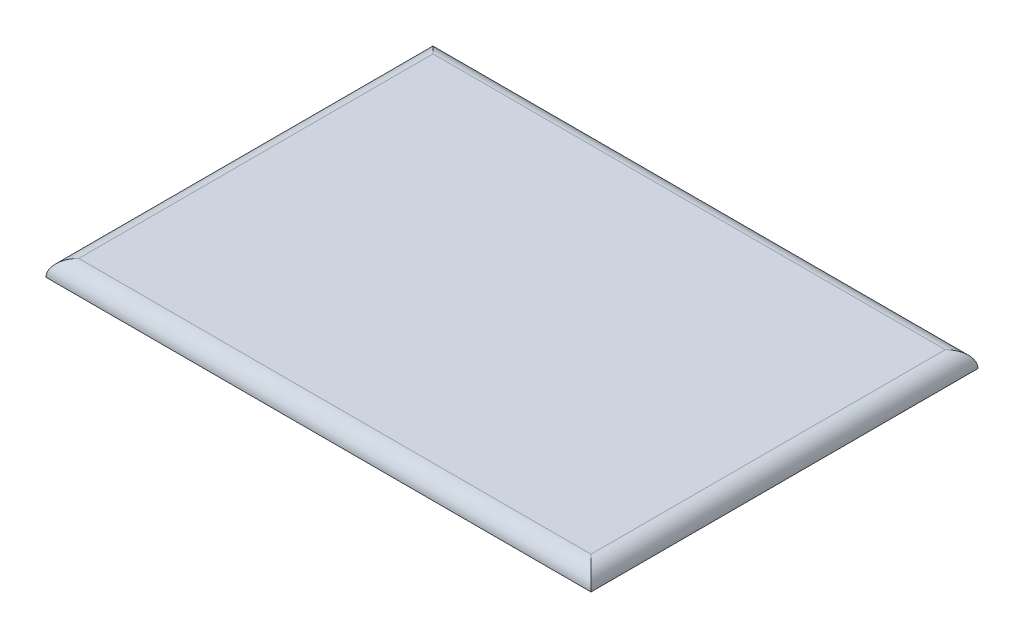
ISO-10303-21;
HEADER;
FILE_DESCRIPTION(('STEP AP214'),'2;1');
FILE_NAME('part.step','',(''),(''),'','','');
FILE_SCHEMA(('AUTOMOTIVE_DESIGN { 1 0 10303 214 1 1 1 1 }'));
ENDSEC;
DATA;
#1=APPLICATION_CONTEXT('core data for automotive mechanical design processes');
#2=APPLICATION_PROTOCOL_DEFINITION('international standard','automotive_design',2000,#1);
#3=PRODUCT_CONTEXT('',#1,'mechanical');
#4=PRODUCT('Part','Part','',(#3));
#5=PRODUCT_RELATED_PRODUCT_CATEGORY('part','',(#4));
#6=PRODUCT_DEFINITION_FORMATION('','',#4);
#7=PRODUCT_DEFINITION_CONTEXT('part definition',#1,'design');
#8=PRODUCT_DEFINITION('design','',#6,#7);
#9=PRODUCT_DEFINITION_SHAPE('','',#8);
#10=(LENGTH_UNIT() NAMED_UNIT(*) SI_UNIT(.MILLI.,.METRE.));
#11=(NAMED_UNIT(*) PLANE_ANGLE_UNIT() SI_UNIT($,.RADIAN.));
#12=(NAMED_UNIT(*) SI_UNIT($,.STERADIAN.) SOLID_ANGLE_UNIT());
#13=UNCERTAINTY_MEASURE_WITH_UNIT(LENGTH_MEASURE(1.E-05),#10,'distance_accuracy_value','');
#14=(GEOMETRIC_REPRESENTATION_CONTEXT(3) GLOBAL_UNCERTAINTY_ASSIGNED_CONTEXT((#13)) GLOBAL_UNIT_ASSIGNED_CONTEXT((#10,
#11,#12)) REPRESENTATION_CONTEXT('',''));
#15=CARTESIAN_POINT('',(0.,0.,0.));
#16=DIRECTION('',(0.,0.,1.));
#17=DIRECTION('',(1.,0.,0.));
#18=AXIS2_PLACEMENT_3D('',#15,#16,#17);
#19=CARTESIAN_POINT('',(0.,3.,0.));
#20=DIRECTION('',(0.,1.,0.));
#21=DIRECTION('',(0.,0.,1.));
#22=AXIS2_PLACEMENT_3D('',#19,#20,#21);
#23=PLANE('',#22);
#24=DIRECTION('',(0.,0.,-1.));
#25=VECTOR('',#24,1.);
#26=CARTESIAN_POINT('',(42.2165670634108,3.,-37.8188671172709));
#27=LINE('',#26,#25);
#28=CARTESIAN_POINT('',(42.2165670634108,3.,30.1811328827291));
#29=VERTEX_POINT('',#28);
#30=CARTESIAN_POINT('',(42.2165670634108,3.,-34.8188671172709));
#31=VERTEX_POINT('',#30);
#32=EDGE_CURVE('E42',#29,#31,#27,.T.);
#33=ORIENTED_EDGE('',*,*,#32,.T.);
#34=DIRECTION('',(-1.,0.,0.));
#35=VECTOR('',#34,1.);
#36=CARTESIAN_POINT('',(-54.7834329365892,3.,-34.8188671172709));
#37=LINE('',#36,#35);
#38=CARTESIAN_POINT('',(-51.7834329365892,3.,-34.8188671172709));
#39=VERTEX_POINT('',#38);
#40=EDGE_CURVE('E11',#31,#39,#37,.T.);
#41=ORIENTED_EDGE('',*,*,#40,.T.);
#42=DIRECTION('',(0.,0.,1.));
#43=VECTOR('',#42,1.);
#44=CARTESIAN_POINT('',(-51.7834329365892,3.,33.1811328827291));
#45=LINE('',#44,#43);
#46=CARTESIAN_POINT('',(-51.7834329365892,3.,30.1811328827291));
#47=VERTEX_POINT('',#46);
#48=EDGE_CURVE('E98',#39,#47,#45,.T.);
#49=ORIENTED_EDGE('',*,*,#48,.T.);
#50=DIRECTION('',(1.,0.,0.));
#51=VECTOR('',#50,1.);
#52=CARTESIAN_POINT('',(45.2165670634108,3.,30.1811328827291));
#53=LINE('',#52,#51);
#54=EDGE_CURVE('E53',#47,#29,#53,.T.);
#55=ORIENTED_EDGE('',*,*,#54,.T.);
#56=EDGE_LOOP('',(#33,#41,#49,#55));
#57=FACE_BOUND('',#56,.T.);
#58=ADVANCED_FACE('F33',(#57),#23,.T.);
#59=CARTESIAN_POINT('',(0.,0.,0.));
#60=DIRECTION('',(0.,1.,0.));
#61=DIRECTION('',(0.,0.,1.));
#62=AXIS2_PLACEMENT_3D('',#59,#60,#61);
#63=PLANE('',#62);
#64=DIRECTION('',(0.,0.,1.));
#65=VECTOR('',#64,1.);
#66=CARTESIAN_POINT('',(-54.7834329365892,0.,-37.8188671172709));
#67=LINE('',#66,#65);
#68=CARTESIAN_POINT('',(-54.7834329365892,0.,-37.8188671172709));
#69=VERTEX_POINT('',#68);
#70=CARTESIAN_POINT('',(-54.7834329365892,0.,33.1811328827291));
#71=VERTEX_POINT('',#70);
#72=EDGE_CURVE('E78',#69,#71,#67,.T.);
#73=ORIENTED_EDGE('',*,*,#72,.F.);
#74=DIRECTION('',(-1.,0.,0.));
#75=VECTOR('',#74,1.);
#76=CARTESIAN_POINT('',(-54.7834329365892,0.,-37.8188671172709));
#77=LINE('',#76,#75);
#78=CARTESIAN_POINT('',(45.2165670634108,0.,-37.8188671172709));
#79=VERTEX_POINT('',#78);
#80=EDGE_CURVE('E96',#79,#69,#77,.T.);
#81=ORIENTED_EDGE('',*,*,#80,.F.);
#82=DIRECTION('',(0.,0.,-1.));
#83=VECTOR('',#82,1.);
#84=CARTESIAN_POINT('',(45.2165670634108,0.,-37.8188671172709));
#85=LINE('',#84,#83);
#86=CARTESIAN_POINT('',(45.2165670634108,0.,33.1811328827291));
#87=VERTEX_POINT('',#86);
#88=EDGE_CURVE('E81',#87,#79,#85,.T.);
#89=ORIENTED_EDGE('',*,*,#88,.F.);
#90=DIRECTION('',(1.,0.,0.));
#91=VECTOR('',#90,1.);
#92=CARTESIAN_POINT('',(-54.7834329365892,0.,33.1811328827291));
#93=LINE('',#92,#91);
#94=EDGE_CURVE('E73',#71,#87,#93,.T.);
#95=ORIENTED_EDGE('',*,*,#94,.F.);
#96=EDGE_LOOP('',(#73,#81,#89,#95));
#97=FACE_BOUND('',#96,.T.);
#98=ADVANCED_FACE('F75',(#97),#63,.F.);
#99=CARTESIAN_POINT('',(0.,0.,30.1811328827291));
#100=DIRECTION('',(-1.,0.,0.));
#101=DIRECTION('',(0.,0.,1.));
#102=AXIS2_PLACEMENT_3D('',#99,#100,#101);
#103=CYLINDRICAL_SURFACE('',#102,3.);
#104=CARTESIAN_POINT('',(-51.7834329365892,0.,30.1811328827291));
#105=DIRECTION('',(-0.707106781186548,0.,-0.707106781186547));
#106=DIRECTION('',(0.707106781186547,0.,-0.707106781186548));
#107=AXIS2_PLACEMENT_3D('',#104,#105,#106);
#108=ELLIPSE('',#107,4.24264068711928,3.);
#109=EDGE_CURVE('E86',#71,#47,#108,.T.);
#110=ORIENTED_EDGE('',*,*,#109,.F.);
#111=ORIENTED_EDGE('',*,*,#94,.T.);
#112=CARTESIAN_POINT('',(42.2165670634108,0.,30.1811328827291));
#113=DIRECTION('',(-0.707106781186547,0.,0.707106781186548));
#114=DIRECTION('',(-0.707106781186548,0.,-0.707106781186547));
#115=AXIS2_PLACEMENT_3D('',#112,#113,#114);
#116=ELLIPSE('',#115,4.24264068711929,3.);
#117=EDGE_CURVE('E37',#29,#87,#116,.F.);
#118=ORIENTED_EDGE('',*,*,#117,.F.);
#119=ORIENTED_EDGE('',*,*,#54,.F.);
#120=EDGE_LOOP('',(#110,#111,#118,#119));
#121=FACE_BOUND('',#120,.T.);
#122=ADVANCED_FACE('F35',(#121),#103,.T.);
#123=CARTESIAN_POINT('',(42.2165670634108,0.,0.));
#124=DIRECTION('',(0.,0.,1.));
#125=DIRECTION('',(1.,0.,0.));
#126=AXIS2_PLACEMENT_3D('',#123,#124,#125);
#127=CYLINDRICAL_SURFACE('',#126,3.);
#128=ORIENTED_EDGE('',*,*,#117,.T.);
#129=ORIENTED_EDGE('',*,*,#88,.T.);
#130=CARTESIAN_POINT('',(42.2165670634108,0.,-34.8188671172709));
#131=DIRECTION('',(0.707106781186548,0.,0.707106781186547));
#132=DIRECTION('',(-0.707106781186547,0.,0.707106781186548));
#133=AXIS2_PLACEMENT_3D('',#130,#131,#132);
#134=ELLIPSE('',#133,4.24264068711928,3.);
#135=EDGE_CURVE('E89',#31,#79,#134,.F.);
#136=ORIENTED_EDGE('',*,*,#135,.F.);
#137=ORIENTED_EDGE('',*,*,#32,.F.);
#138=EDGE_LOOP('',(#128,#129,#136,#137));
#139=FACE_BOUND('',#138,.T.);
#140=ADVANCED_FACE('F107',(#139),#127,.T.);
#141=CARTESIAN_POINT('',(-51.7834329365892,0.,0.));
#142=DIRECTION('',(0.,0.,-1.));
#143=DIRECTION('',(-1.,0.,0.));
#144=AXIS2_PLACEMENT_3D('',#141,#142,#143);
#145=CYLINDRICAL_SURFACE('',#144,3.);
#146=ORIENTED_EDGE('',*,*,#109,.T.);
#147=ORIENTED_EDGE('',*,*,#48,.F.);
#148=CARTESIAN_POINT('',(-51.7834329365892,0.,-34.8188671172709));
#149=DIRECTION('',(0.707106781186547,0.,-0.707106781186548));
#150=DIRECTION('',(-0.707106781186548,0.,-0.707106781186547));
#151=AXIS2_PLACEMENT_3D('',#148,#149,#150);
#152=ELLIPSE('',#151,4.24264068711929,3.);
#153=EDGE_CURVE('E92',#69,#39,#152,.T.);
#154=ORIENTED_EDGE('',*,*,#153,.F.);
#155=ORIENTED_EDGE('',*,*,#72,.T.);
#156=EDGE_LOOP('',(#146,#147,#154,#155));
#157=FACE_BOUND('',#156,.T.);
#158=ADVANCED_FACE('F91',(#157),#145,.T.);
#159=CARTESIAN_POINT('',(0.,0.,-34.8188671172709));
#160=DIRECTION('',(1.,0.,0.));
#161=DIRECTION('',(0.,0.,-1.));
#162=AXIS2_PLACEMENT_3D('',#159,#160,#161);
#163=CYLINDRICAL_SURFACE('',#162,3.);
#164=ORIENTED_EDGE('',*,*,#135,.T.);
#165=ORIENTED_EDGE('',*,*,#80,.T.);
#166=ORIENTED_EDGE('',*,*,#153,.T.);
#167=ORIENTED_EDGE('',*,*,#40,.F.);
#168=EDGE_LOOP('',(#164,#165,#166,#167));
#169=FACE_BOUND('',#168,.T.);
#170=ADVANCED_FACE('F105',(#169),#163,.T.);
#171=CLOSED_SHELL('',(#58,#98,#122,#140,#158,#170));
#172=MANIFOLD_SOLID_BREP('B2',#171);
#173=ADVANCED_BREP_SHAPE_REPRESENTATION('',(#18,#172),#14);
#174=SHAPE_DEFINITION_REPRESENTATION(#9,#173);
ENDSEC;
END-ISO-10303-21;
